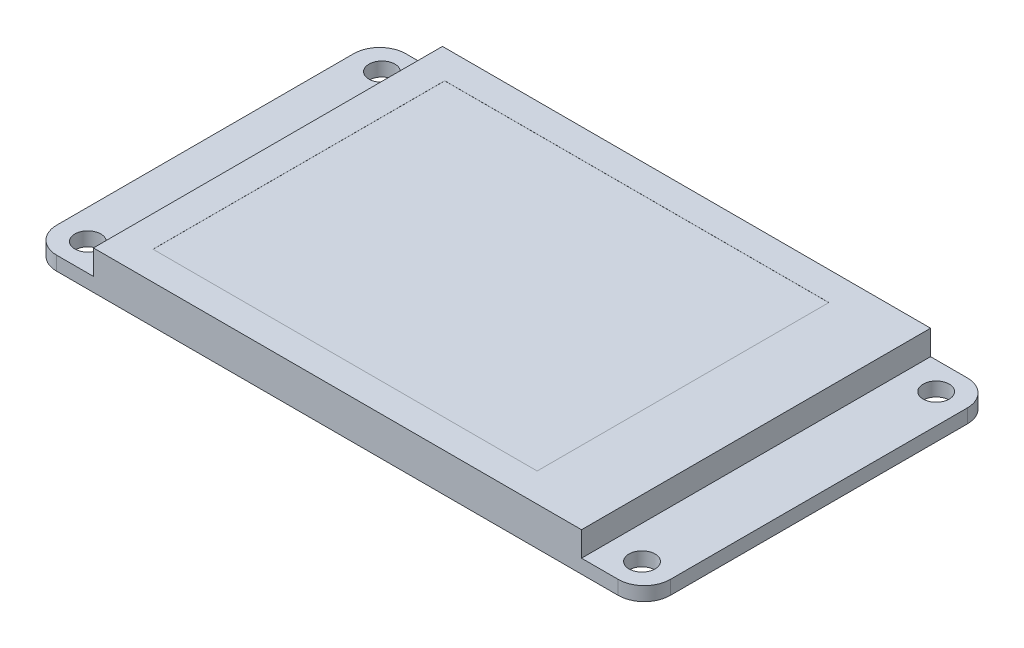
ISO-10303-21;
HEADER;
FILE_DESCRIPTION(('STEP AP214'),'2;1');
FILE_NAME('part.step','',(''),(''),'','','');
FILE_SCHEMA(('AUTOMOTIVE_DESIGN { 1 0 10303 214 1 1 1 1 }'));
ENDSEC;
DATA;
#1=APPLICATION_CONTEXT('core data for automotive mechanical design processes');
#2=APPLICATION_PROTOCOL_DEFINITION('international standard','automotive_design',2000,#1);
#3=PRODUCT_CONTEXT('',#1,'mechanical');
#4=PRODUCT('Part','Part','',(#3));
#5=PRODUCT_RELATED_PRODUCT_CATEGORY('part','',(#4));
#6=PRODUCT_DEFINITION_FORMATION('','',#4);
#7=PRODUCT_DEFINITION_CONTEXT('part definition',#1,'design');
#8=PRODUCT_DEFINITION('design','',#6,#7);
#9=PRODUCT_DEFINITION_SHAPE('','',#8);
#10=(LENGTH_UNIT() NAMED_UNIT(*) SI_UNIT(.MILLI.,.METRE.));
#11=(NAMED_UNIT(*) PLANE_ANGLE_UNIT() SI_UNIT($,.RADIAN.));
#12=(NAMED_UNIT(*) SI_UNIT($,.STERADIAN.) SOLID_ANGLE_UNIT());
#13=UNCERTAINTY_MEASURE_WITH_UNIT(LENGTH_MEASURE(1.E-05),#10,'distance_accuracy_value','');
#14=(GEOMETRIC_REPRESENTATION_CONTEXT(3) GLOBAL_UNCERTAINTY_ASSIGNED_CONTEXT((#13)) GLOBAL_UNIT_ASSIGNED_CONTEXT((#10,
#11,#12)) REPRESENTATION_CONTEXT('',''));
#15=CARTESIAN_POINT('',(0.,0.,0.));
#16=DIRECTION('',(0.,0.,1.));
#17=DIRECTION('',(1.,0.,0.));
#18=AXIS2_PLACEMENT_3D('',#15,#16,#17);
#19=CARTESIAN_POINT('',(0.,1.6,0.));
#20=DIRECTION('',(0.,1.,0.));
#21=DIRECTION('',(0.,0.,1.));
#22=AXIS2_PLACEMENT_3D('',#19,#20,#21);
#23=PLANE('',#22);
#24=DIRECTION('',(0.,0.,1.));
#25=VECTOR('',#24,1.);
#26=CARTESIAN_POINT('',(-30.7569975339088,1.6,-23.259617755857));
#27=LINE('',#26,#25);
#28=CARTESIAN_POINT('',(-30.7569975339088,1.6,-23.259617755857));
#29=VERTEX_POINT('',#28);
#30=CARTESIAN_POINT('',(-30.7569975339088,1.6,16.930382244143));
#31=VERTEX_POINT('',#30);
#32=EDGE_CURVE('E58',#29,#31,#27,.T.);
#33=ORIENTED_EDGE('',*,*,#32,.F.);
#34=DIRECTION('',(-1.,0.,0.));
#35=VECTOR('',#34,1.);
#36=CARTESIAN_POINT('',(-37.9819975339088,1.6,-23.259617755857));
#37=LINE('',#36,#35);
#38=CARTESIAN_POINT('',(-34.9819975339088,1.6,-23.259617755857));
#39=VERTEX_POINT('',#38);
#40=EDGE_CURVE('E246',#29,#39,#37,.T.);
#41=ORIENTED_EDGE('',*,*,#40,.T.);
#42=CARTESIAN_POINT('',(-34.9819975339088,1.6,-20.259617755857));
#43=DIRECTION('',(0.,1.,0.));
#44=DIRECTION('',(0.,0.,1.));
#45=AXIS2_PLACEMENT_3D('',#42,#43,#44);
#46=CIRCLE('',#45,3.);
#47=CARTESIAN_POINT('',(-37.9819975339088,1.6,-20.259617755857));
#48=VERTEX_POINT('',#47);
#49=EDGE_CURVE('E280',#39,#48,#46,.T.);
#50=ORIENTED_EDGE('',*,*,#49,.T.);
#51=DIRECTION('',(0.,0.,1.));
#52=VECTOR('',#51,1.);
#53=CARTESIAN_POINT('',(-37.9819975339088,1.6,-23.259617755857));
#54=LINE('',#53,#52);
#55=CARTESIAN_POINT('',(-37.9819975339088,1.6,13.930382244143));
#56=VERTEX_POINT('',#55);
#57=EDGE_CURVE('E236',#48,#56,#54,.T.);
#58=ORIENTED_EDGE('',*,*,#57,.T.);
#59=CARTESIAN_POINT('',(-34.9819975339088,1.6,13.930382244143));
#60=DIRECTION('',(0.,1.,0.));
#61=DIRECTION('',(0.,0.,1.));
#62=AXIS2_PLACEMENT_3D('',#59,#60,#61);
#63=CIRCLE('',#62,3.);
#64=CARTESIAN_POINT('',(-34.9819975339088,1.6,16.930382244143));
#65=VERTEX_POINT('',#64);
#66=EDGE_CURVE('E278',#56,#65,#63,.T.);
#67=ORIENTED_EDGE('',*,*,#66,.T.);
#68=DIRECTION('',(1.,0.,0.));
#69=VECTOR('',#68,1.);
#70=CARTESIAN_POINT('',(-37.9819975339088,1.6,16.930382244143));
#71=LINE('',#70,#69);
#72=EDGE_CURVE('E241',#65,#31,#71,.T.);
#73=ORIENTED_EDGE('',*,*,#72,.T.);
#74=EDGE_LOOP('',(#33,#41,#50,#58,#67,#73));
#75=FACE_BOUND('',#74,.T.);
#76=CARTESIAN_POINT('',(-34.5619975339088,1.6,-20.099617755857));
#77=DIRECTION('',(0.,1.,0.));
#78=DIRECTION('',(0.,0.,1.));
#79=AXIS2_PLACEMENT_3D('',#76,#77,#78);
#80=CIRCLE('',#79,1.5);
#81=CARTESIAN_POINT('',(-34.5619975339088,1.6,-18.599617755857));
#82=VERTEX_POINT('',#81);
#83=EDGE_CURVE('E221',#82,#82,#80,.T.);
#84=ORIENTED_EDGE('',*,*,#83,.F.);
#85=EDGE_LOOP('',(#84));
#86=FACE_BOUND('',#85,.T.);
#87=CARTESIAN_POINT('',(-34.5619975339088,1.6,13.770382244143));
#88=DIRECTION('',(0.,1.,0.));
#89=DIRECTION('',(0.,0.,1.));
#90=AXIS2_PLACEMENT_3D('',#87,#88,#89);
#91=CIRCLE('',#90,1.5);
#92=CARTESIAN_POINT('',(-34.5619975339088,1.6,15.270382244143));
#93=VERTEX_POINT('',#92);
#94=EDGE_CURVE('E215',#93,#93,#91,.T.);
#95=ORIENTED_EDGE('',*,*,#94,.F.);
#96=EDGE_LOOP('',(#95));
#97=FACE_BOUND('',#96,.T.);
#98=ADVANCED_FACE('F35',(#75,#86,#97),#23,.T.);
#99=CARTESIAN_POINT('',(-37.9819975339088,1.6,-23.259617755857));
#100=DIRECTION('',(1.,0.,0.));
#101=DIRECTION('',(0.,0.,-1.));
#102=AXIS2_PLACEMENT_3D('',#99,#100,#101);
#103=PLANE('',#102);
#104=ORIENTED_EDGE('',*,*,#57,.F.);
#105=DIRECTION('',(0.,-1.,0.));
#106=VECTOR('',#105,1.);
#107=CARTESIAN_POINT('',(-37.9819975339088,1.6,-20.259617755857));
#108=LINE('',#107,#106);
#109=CARTESIAN_POINT('',(-37.9819975339088,0.,-20.259617755857));
#110=VERTEX_POINT('',#109);
#111=EDGE_CURVE('E11',#48,#110,#108,.T.);
#112=ORIENTED_EDGE('',*,*,#111,.T.);
#113=DIRECTION('',(0.,0.,1.));
#114=VECTOR('',#113,1.);
#115=CARTESIAN_POINT('',(-37.9819975339088,0.,-23.259617755857));
#116=LINE('',#115,#114);
#117=CARTESIAN_POINT('',(-37.9819975339088,0.,13.930382244143));
#118=VERTEX_POINT('',#117);
#119=EDGE_CURVE('E233',#110,#118,#116,.T.);
#120=ORIENTED_EDGE('',*,*,#119,.T.);
#121=DIRECTION('',(0.,-1.,0.));
#122=VECTOR('',#121,1.);
#123=CARTESIAN_POINT('',(-37.9819975339088,1.6,13.930382244143));
#124=LINE('',#123,#122);
#125=EDGE_CURVE('E43',#118,#56,#124,.F.);
#126=ORIENTED_EDGE('',*,*,#125,.T.);
#127=EDGE_LOOP('',(#104,#112,#120,#126));
#128=FACE_BOUND('',#127,.T.);
#129=ADVANCED_FACE('F294',(#128),#103,.F.);
#130=CARTESIAN_POINT('',(-37.9819975339088,1.6,16.930382244143));
#131=DIRECTION('',(0.,0.,-1.));
#132=DIRECTION('',(-1.,0.,0.));
#133=AXIS2_PLACEMENT_3D('',#130,#131,#132);
#134=PLANE('',#133);
#135=DIRECTION('',(1.,0.,0.));
#136=VECTOR('',#135,1.);
#137=CARTESIAN_POINT('',(-37.9819975339088,0.,16.930382244143));
#138=LINE('',#137,#136);
#139=CARTESIAN_POINT('',(-34.9819975339088,0.,16.930382244143));
#140=VERTEX_POINT('',#139);
#141=CARTESIAN_POINT('',(29.6680024660912,0.,16.930382244143));
#142=VERTEX_POINT('',#141);
#143=EDGE_CURVE('E252',#140,#142,#138,.T.);
#144=ORIENTED_EDGE('',*,*,#143,.T.);
#145=DIRECTION('',(0.,-1.,0.));
#146=VECTOR('',#145,1.);
#147=CARTESIAN_POINT('',(29.6680024660912,1.6,16.930382244143));
#148=LINE('',#147,#146);
#149=CARTESIAN_POINT('',(29.6680024660912,1.6,16.930382244143));
#150=VERTEX_POINT('',#149);
#151=EDGE_CURVE('E275',#142,#150,#148,.F.);
#152=ORIENTED_EDGE('',*,*,#151,.T.);
#153=CARTESIAN_POINT('',(25.4430024660912,1.6,16.930382244143));
#154=VERTEX_POINT('',#153);
#155=EDGE_CURVE('E239',#154,#150,#71,.T.);
#156=ORIENTED_EDGE('',*,*,#155,.F.);
#157=DIRECTION('',(0.,-1.,0.));
#158=VECTOR('',#157,1.);
#159=CARTESIAN_POINT('',(25.4430024660912,4.44,16.930382244143));
#160=LINE('',#159,#158);
#161=CARTESIAN_POINT('',(25.4430024660912,4.44,16.930382244143));
#162=VERTEX_POINT('',#161);
#163=EDGE_CURVE('E205',#162,#154,#160,.T.);
#164=ORIENTED_EDGE('',*,*,#163,.F.);
#165=DIRECTION('',(1.,0.,0.));
#166=VECTOR('',#165,1.);
#167=CARTESIAN_POINT('',(-30.7569975339088,4.44,16.930382244143));
#168=LINE('',#167,#166);
#169=CARTESIAN_POINT('',(-30.7569975339088,4.44,16.930382244143));
#170=VERTEX_POINT('',#169);
#171=EDGE_CURVE('E189',#170,#162,#168,.T.);
#172=ORIENTED_EDGE('',*,*,#171,.F.);
#173=DIRECTION('',(0.,-1.,0.));
#174=VECTOR('',#173,1.);
#175=CARTESIAN_POINT('',(-30.7569975339088,4.44,16.930382244143));
#176=LINE('',#175,#174);
#177=EDGE_CURVE('E208',#170,#31,#176,.T.);
#178=ORIENTED_EDGE('',*,*,#177,.T.);
#179=ORIENTED_EDGE('',*,*,#72,.F.);
#180=DIRECTION('',(0.,-1.,0.));
#181=VECTOR('',#180,1.);
#182=CARTESIAN_POINT('',(-34.9819975339088,1.6,16.930382244143));
#183=LINE('',#182,#181);
#184=EDGE_CURVE('E272',#65,#140,#183,.T.);
#185=ORIENTED_EDGE('',*,*,#184,.T.);
#186=EDGE_LOOP('',(#144,#152,#156,#164,#172,#178,#179,#185));
#187=FACE_BOUND('',#186,.T.);
#188=ADVANCED_FACE('F305',(#187),#134,.F.);
#189=CARTESIAN_POINT('',(32.6680024660912,1.6,-23.259617755857));
#190=DIRECTION('',(-1.,0.,0.));
#191=DIRECTION('',(0.,0.,1.));
#192=AXIS2_PLACEMENT_3D('',#189,#190,#191);
#193=PLANE('',#192);
#194=DIRECTION('',(0.,0.,-1.));
#195=VECTOR('',#194,1.);
#196=CARTESIAN_POINT('',(32.6680024660912,1.6,-23.259617755857));
#197=LINE('',#196,#195);
#198=CARTESIAN_POINT('',(32.6680024660912,1.6,13.930382244143));
#199=VERTEX_POINT('',#198);
#200=CARTESIAN_POINT('',(32.6680024660912,1.6,-20.259617755857));
#201=VERTEX_POINT('',#200);
#202=EDGE_CURVE('E243',#199,#201,#197,.T.);
#203=ORIENTED_EDGE('',*,*,#202,.F.);
#204=DIRECTION('',(0.,-1.,0.));
#205=VECTOR('',#204,1.);
#206=CARTESIAN_POINT('',(32.6680024660912,1.6,13.930382244143));
#207=LINE('',#206,#205);
#208=CARTESIAN_POINT('',(32.6680024660912,0.,13.930382244143));
#209=VERTEX_POINT('',#208);
#210=EDGE_CURVE('E261',#199,#209,#207,.T.);
#211=ORIENTED_EDGE('',*,*,#210,.T.);
#212=DIRECTION('',(0.,0.,-1.));
#213=VECTOR('',#212,1.);
#214=CARTESIAN_POINT('',(32.6680024660912,0.,-23.259617755857));
#215=LINE('',#214,#213);
#216=CARTESIAN_POINT('',(32.6680024660912,0.,-20.259617755857));
#217=VERTEX_POINT('',#216);
#218=EDGE_CURVE('E255',#209,#217,#215,.T.);
#219=ORIENTED_EDGE('',*,*,#218,.T.);
#220=DIRECTION('',(0.,-1.,0.));
#221=VECTOR('',#220,1.);
#222=CARTESIAN_POINT('',(32.6680024660912,1.6,-20.259617755857));
#223=LINE('',#222,#221);
#224=EDGE_CURVE('E249',#217,#201,#223,.F.);
#225=ORIENTED_EDGE('',*,*,#224,.T.);
#226=EDGE_LOOP('',(#203,#211,#219,#225));
#227=FACE_BOUND('',#226,.T.);
#228=ADVANCED_FACE('F316',(#227),#193,.F.);
#229=CARTESIAN_POINT('',(-37.9819975339088,1.6,-23.259617755857));
#230=DIRECTION('',(0.,0.,1.));
#231=DIRECTION('',(1.,0.,0.));
#232=AXIS2_PLACEMENT_3D('',#229,#230,#231);
#233=PLANE('',#232);
#234=CARTESIAN_POINT('',(29.6680024660912,1.6,-23.259617755857));
#235=VERTEX_POINT('',#234);
#236=CARTESIAN_POINT('',(25.4430024660912,1.6,-23.259617755857));
#237=VERTEX_POINT('',#236);
#238=EDGE_CURVE('E247',#235,#237,#37,.T.);
#239=ORIENTED_EDGE('',*,*,#238,.F.);
#240=DIRECTION('',(0.,-1.,0.));
#241=VECTOR('',#240,1.);
#242=CARTESIAN_POINT('',(29.6680024660912,1.6,-23.259617755857));
#243=LINE('',#242,#241);
#244=CARTESIAN_POINT('',(29.6680024660912,0.,-23.259617755857));
#245=VERTEX_POINT('',#244);
#246=EDGE_CURVE('E289',#235,#245,#243,.T.);
#247=ORIENTED_EDGE('',*,*,#246,.T.);
#248=DIRECTION('',(-1.,0.,0.));
#249=VECTOR('',#248,1.);
#250=CARTESIAN_POINT('',(-37.9819975339088,0.,-23.259617755857));
#251=LINE('',#250,#249);
#252=CARTESIAN_POINT('',(-34.9819975339088,0.,-23.259617755857));
#253=VERTEX_POINT('',#252);
#254=EDGE_CURVE('E240',#245,#253,#251,.T.);
#255=ORIENTED_EDGE('',*,*,#254,.T.);
#256=DIRECTION('',(0.,-1.,0.));
#257=VECTOR('',#256,1.);
#258=CARTESIAN_POINT('',(-34.9819975339088,1.6,-23.259617755857));
#259=LINE('',#258,#257);
#260=EDGE_CURVE('E286',#253,#39,#259,.F.);
#261=ORIENTED_EDGE('',*,*,#260,.T.);
#262=ORIENTED_EDGE('',*,*,#40,.F.);
#263=DIRECTION('',(0.,-1.,0.));
#264=VECTOR('',#263,1.);
#265=CARTESIAN_POINT('',(-30.7569975339088,4.44,-23.259617755857));
#266=LINE('',#265,#264);
#267=CARTESIAN_POINT('',(-30.7569975339088,4.44,-23.259617755857));
#268=VERTEX_POINT('',#267);
#269=EDGE_CURVE('E196',#268,#29,#266,.T.);
#270=ORIENTED_EDGE('',*,*,#269,.F.);
#271=DIRECTION('',(-1.,0.,0.));
#272=VECTOR('',#271,1.);
#273=CARTESIAN_POINT('',(-30.7569975339088,4.44,-23.259617755857));
#274=LINE('',#273,#272);
#275=CARTESIAN_POINT('',(25.4430024660912,4.44,-23.259617755857));
#276=VERTEX_POINT('',#275);
#277=EDGE_CURVE('E194',#276,#268,#274,.T.);
#278=ORIENTED_EDGE('',*,*,#277,.F.);
#279=DIRECTION('',(0.,-1.,0.));
#280=VECTOR('',#279,1.);
#281=CARTESIAN_POINT('',(25.4430024660912,4.44,-23.259617755857));
#282=LINE('',#281,#280);
#283=EDGE_CURVE('E202',#276,#237,#282,.T.);
#284=ORIENTED_EDGE('',*,*,#283,.T.);
#285=EDGE_LOOP('',(#239,#247,#255,#261,#262,#270,#278,#284));
#286=FACE_BOUND('',#285,.T.);
#287=ADVANCED_FACE('F328',(#286),#233,.F.);
#288=DIRECTION('',(0.,0.,-1.));
#289=VECTOR('',#288,1.);
#290=CARTESIAN_POINT('',(25.4430024660912,1.6,-23.259617755857));
#291=LINE('',#290,#289);
#292=EDGE_CURVE('E190',#154,#237,#291,.T.);
#293=ORIENTED_EDGE('',*,*,#292,.F.);
#294=ORIENTED_EDGE('',*,*,#155,.T.);
#295=CARTESIAN_POINT('',(29.6680024660912,1.6,13.930382244143));
#296=DIRECTION('',(0.,1.,0.));
#297=DIRECTION('',(0.,0.,1.));
#298=AXIS2_PLACEMENT_3D('',#295,#296,#297);
#299=CIRCLE('',#298,3.);
#300=EDGE_CURVE('E284',#150,#199,#299,.T.);
#301=ORIENTED_EDGE('',*,*,#300,.T.);
#302=ORIENTED_EDGE('',*,*,#202,.T.);
#303=CARTESIAN_POINT('',(29.6680024660912,1.6,-20.259617755857));
#304=DIRECTION('',(0.,1.,0.));
#305=DIRECTION('',(0.,0.,1.));
#306=AXIS2_PLACEMENT_3D('',#303,#304,#305);
#307=CIRCLE('',#306,3.);
#308=EDGE_CURVE('E282',#201,#235,#307,.T.);
#309=ORIENTED_EDGE('',*,*,#308,.T.);
#310=ORIENTED_EDGE('',*,*,#238,.T.);
#311=EDGE_LOOP('',(#293,#294,#301,#302,#309,#310));
#312=FACE_BOUND('',#311,.T.);
#313=CARTESIAN_POINT('',(29.2480024660912,1.6,-20.099617755857));
#314=DIRECTION('',(0.,1.,0.));
#315=DIRECTION('',(0.,0.,1.));
#316=AXIS2_PLACEMENT_3D('',#313,#314,#315);
#317=CIRCLE('',#316,1.5);
#318=CARTESIAN_POINT('',(29.2480024660912,1.6,-18.599617755857));
#319=VERTEX_POINT('',#318);
#320=EDGE_CURVE('E222',#319,#319,#317,.T.);
#321=ORIENTED_EDGE('',*,*,#320,.F.);
#322=EDGE_LOOP('',(#321));
#323=FACE_BOUND('',#322,.T.);
#324=CARTESIAN_POINT('',(29.2480024660912,1.6,13.770382244143));
#325=DIRECTION('',(0.,1.,0.));
#326=DIRECTION('',(0.,0.,1.));
#327=AXIS2_PLACEMENT_3D('',#324,#325,#326);
#328=CIRCLE('',#327,1.5);
#329=CARTESIAN_POINT('',(29.2480024660912,1.6,15.270382244143));
#330=VERTEX_POINT('',#329);
#331=EDGE_CURVE('E211',#330,#330,#328,.T.);
#332=ORIENTED_EDGE('',*,*,#331,.F.);
#333=EDGE_LOOP('',(#332));
#334=FACE_BOUND('',#333,.T.);
#335=ADVANCED_FACE('F320',(#312,#323,#334),#23,.T.);
#336=CARTESIAN_POINT('',(0.,0.,0.));
#337=DIRECTION('',(0.,1.,0.));
#338=DIRECTION('',(0.,0.,1.));
#339=AXIS2_PLACEMENT_3D('',#336,#337,#338);
#340=PLANE('',#339);
#341=CARTESIAN_POINT('',(29.2480024660912,0.,-20.099617755857));
#342=DIRECTION('',(0.,1.,0.));
#343=DIRECTION('',(0.,0.,1.));
#344=AXIS2_PLACEMENT_3D('',#341,#342,#343);
#345=CIRCLE('',#344,1.5);
#346=CARTESIAN_POINT('',(29.2480024660912,0.,-18.599617755857));
#347=VERTEX_POINT('',#346);
#348=EDGE_CURVE('E218',#347,#347,#345,.T.);
#349=ORIENTED_EDGE('',*,*,#348,.T.);
#350=EDGE_LOOP('',(#349));
#351=FACE_BOUND('',#350,.T.);
#352=CARTESIAN_POINT('',(-34.5619975339088,0.,13.770382244143));
#353=DIRECTION('',(0.,1.,0.));
#354=DIRECTION('',(0.,0.,1.));
#355=AXIS2_PLACEMENT_3D('',#352,#353,#354);
#356=CIRCLE('',#355,1.5);
#357=CARTESIAN_POINT('',(-34.5619975339088,0.,15.270382244143));
#358=VERTEX_POINT('',#357);
#359=EDGE_CURVE('E225',#358,#358,#356,.T.);
#360=ORIENTED_EDGE('',*,*,#359,.T.);
#361=EDGE_LOOP('',(#360));
#362=FACE_BOUND('',#361,.T.);
#363=CARTESIAN_POINT('',(29.2480024660912,0.,13.770382244143));
#364=DIRECTION('',(0.,1.,0.));
#365=DIRECTION('',(0.,0.,1.));
#366=AXIS2_PLACEMENT_3D('',#363,#364,#365);
#367=CIRCLE('',#366,1.5);
#368=CARTESIAN_POINT('',(29.2480024660912,0.,15.270382244143));
#369=VERTEX_POINT('',#368);
#370=EDGE_CURVE('E212',#369,#369,#367,.T.);
#371=ORIENTED_EDGE('',*,*,#370,.T.);
#372=EDGE_LOOP('',(#371));
#373=FACE_BOUND('',#372,.T.);
#374=CARTESIAN_POINT('',(-34.5619975339088,0.,-20.099617755857));
#375=DIRECTION('',(0.,1.,0.));
#376=DIRECTION('',(0.,0.,1.));
#377=AXIS2_PLACEMENT_3D('',#374,#375,#376);
#378=CIRCLE('',#377,1.5);
#379=CARTESIAN_POINT('',(-34.5619975339088,0.,-18.599617755857));
#380=VERTEX_POINT('',#379);
#381=EDGE_CURVE('E230',#380,#380,#378,.T.);
#382=ORIENTED_EDGE('',*,*,#381,.T.);
#383=EDGE_LOOP('',(#382));
#384=FACE_BOUND('',#383,.T.);
#385=ORIENTED_EDGE('',*,*,#218,.F.);
#386=CARTESIAN_POINT('',(29.6680024660912,0.,13.930382244143));
#387=DIRECTION('',(0.,1.,0.));
#388=DIRECTION('',(0.,0.,1.));
#389=AXIS2_PLACEMENT_3D('',#386,#387,#388);
#390=CIRCLE('',#389,3.);
#391=EDGE_CURVE('E270',#209,#142,#390,.F.);
#392=ORIENTED_EDGE('',*,*,#391,.T.);
#393=ORIENTED_EDGE('',*,*,#143,.F.);
#394=CARTESIAN_POINT('',(-34.9819975339088,0.,13.930382244143));
#395=DIRECTION('',(0.,1.,0.));
#396=DIRECTION('',(0.,0.,1.));
#397=AXIS2_PLACEMENT_3D('',#394,#395,#396);
#398=CIRCLE('',#397,3.);
#399=EDGE_CURVE('E264',#140,#118,#398,.F.);
#400=ORIENTED_EDGE('',*,*,#399,.T.);
#401=ORIENTED_EDGE('',*,*,#119,.F.);
#402=CARTESIAN_POINT('',(-34.9819975339088,0.,-20.259617755857));
#403=DIRECTION('',(0.,1.,0.));
#404=DIRECTION('',(0.,0.,1.));
#405=AXIS2_PLACEMENT_3D('',#402,#403,#404);
#406=CIRCLE('',#405,3.);
#407=EDGE_CURVE('E266',#110,#253,#406,.F.);
#408=ORIENTED_EDGE('',*,*,#407,.T.);
#409=ORIENTED_EDGE('',*,*,#254,.F.);
#410=CARTESIAN_POINT('',(29.6680024660912,0.,-20.259617755857));
#411=DIRECTION('',(0.,1.,0.));
#412=DIRECTION('',(0.,0.,1.));
#413=AXIS2_PLACEMENT_3D('',#410,#411,#412);
#414=CIRCLE('',#413,3.);
#415=EDGE_CURVE('E268',#245,#217,#414,.F.);
#416=ORIENTED_EDGE('',*,*,#415,.T.);
#417=EDGE_LOOP('',(#385,#392,#393,#400,#401,#408,#409,#416));
#418=FACE_BOUND('',#417,.T.);
#419=ADVANCED_FACE('F309',(#351,#362,#373,#384,#418),#340,.F.);
#420=CARTESIAN_POINT('',(29.6680024660912,1.6,13.930382244143));
#421=DIRECTION('',(0.,-1.,0.));
#422=DIRECTION('',(0.,0.,-1.));
#423=AXIS2_PLACEMENT_3D('',#420,#421,#422);
#424=CYLINDRICAL_SURFACE('',#423,3.);
#425=ORIENTED_EDGE('',*,*,#300,.F.);
#426=ORIENTED_EDGE('',*,*,#151,.F.);
#427=ORIENTED_EDGE('',*,*,#391,.F.);
#428=ORIENTED_EDGE('',*,*,#210,.F.);
#429=EDGE_LOOP('',(#425,#426,#427,#428));
#430=FACE_BOUND('',#429,.T.);
#431=ADVANCED_FACE('F313',(#430),#424,.T.);
#432=CARTESIAN_POINT('',(29.6680024660912,1.6,-20.259617755857));
#433=DIRECTION('',(0.,-1.,0.));
#434=DIRECTION('',(0.,0.,-1.));
#435=AXIS2_PLACEMENT_3D('',#432,#433,#434);
#436=CYLINDRICAL_SURFACE('',#435,3.);
#437=ORIENTED_EDGE('',*,*,#308,.F.);
#438=ORIENTED_EDGE('',*,*,#224,.F.);
#439=ORIENTED_EDGE('',*,*,#415,.F.);
#440=ORIENTED_EDGE('',*,*,#246,.F.);
#441=EDGE_LOOP('',(#437,#438,#439,#440));
#442=FACE_BOUND('',#441,.T.);
#443=ADVANCED_FACE('F325',(#442),#436,.T.);
#444=CARTESIAN_POINT('',(-34.9819975339088,1.6,-20.259617755857));
#445=DIRECTION('',(0.,-1.,0.));
#446=DIRECTION('',(0.,0.,-1.));
#447=AXIS2_PLACEMENT_3D('',#444,#445,#446);
#448=CYLINDRICAL_SURFACE('',#447,3.);
#449=ORIENTED_EDGE('',*,*,#49,.F.);
#450=ORIENTED_EDGE('',*,*,#260,.F.);
#451=ORIENTED_EDGE('',*,*,#407,.F.);
#452=ORIENTED_EDGE('',*,*,#111,.F.);
#453=EDGE_LOOP('',(#449,#450,#451,#452));
#454=FACE_BOUND('',#453,.T.);
#455=ADVANCED_FACE('F331',(#454),#448,.T.);
#456=CARTESIAN_POINT('',(-34.9819975339088,1.6,13.930382244143));
#457=DIRECTION('',(0.,-1.,0.));
#458=DIRECTION('',(0.,0.,-1.));
#459=AXIS2_PLACEMENT_3D('',#456,#457,#458);
#460=CYLINDRICAL_SURFACE('',#459,3.);
#461=ORIENTED_EDGE('',*,*,#66,.F.);
#462=ORIENTED_EDGE('',*,*,#125,.F.);
#463=ORIENTED_EDGE('',*,*,#399,.F.);
#464=ORIENTED_EDGE('',*,*,#184,.F.);
#465=EDGE_LOOP('',(#461,#462,#463,#464));
#466=FACE_BOUND('',#465,.T.);
#467=ADVANCED_FACE('F37',(#466),#460,.T.);
#468=CARTESIAN_POINT('',(-34.5619975339088,0.,-20.099617755857));
#469=DIRECTION('',(0.,1.,0.));
#470=DIRECTION('',(0.,0.,1.));
#471=AXIS2_PLACEMENT_3D('',#468,#469,#470);
#472=CYLINDRICAL_SURFACE('',#471,1.5);
#473=ORIENTED_EDGE('',*,*,#381,.F.);
#474=EDGE_LOOP('',(#473));
#475=FACE_BOUND('',#474,.T.);
#476=ORIENTED_EDGE('',*,*,#83,.T.);
#477=EDGE_LOOP('',(#476));
#478=FACE_BOUND('',#477,.T.);
#479=ADVANCED_FACE('F385',(#475,#478),#472,.F.);
#480=CARTESIAN_POINT('',(29.2480024660912,0.,13.770382244143));
#481=DIRECTION('',(0.,1.,0.));
#482=DIRECTION('',(0.,0.,1.));
#483=AXIS2_PLACEMENT_3D('',#480,#481,#482);
#484=CYLINDRICAL_SURFACE('',#483,1.5);
#485=ORIENTED_EDGE('',*,*,#370,.F.);
#486=EDGE_LOOP('',(#485));
#487=FACE_BOUND('',#486,.T.);
#488=ORIENTED_EDGE('',*,*,#331,.T.);
#489=EDGE_LOOP('',(#488));
#490=FACE_BOUND('',#489,.T.);
#491=ADVANCED_FACE('F389',(#487,#490),#484,.F.);
#492=CARTESIAN_POINT('',(-34.5619975339088,0.,13.770382244143));
#493=DIRECTION('',(0.,1.,0.));
#494=DIRECTION('',(0.,0.,1.));
#495=AXIS2_PLACEMENT_3D('',#492,#493,#494);
#496=CYLINDRICAL_SURFACE('',#495,1.5);
#497=ORIENTED_EDGE('',*,*,#359,.F.);
#498=EDGE_LOOP('',(#497));
#499=FACE_BOUND('',#498,.T.);
#500=ORIENTED_EDGE('',*,*,#94,.T.);
#501=EDGE_LOOP('',(#500));
#502=FACE_BOUND('',#501,.T.);
#503=ADVANCED_FACE('F394',(#499,#502),#496,.F.);
#504=CARTESIAN_POINT('',(29.2480024660912,0.,-20.099617755857));
#505=DIRECTION('',(0.,1.,0.));
#506=DIRECTION('',(0.,0.,1.));
#507=AXIS2_PLACEMENT_3D('',#504,#505,#506);
#508=CYLINDRICAL_SURFACE('',#507,1.5);
#509=ORIENTED_EDGE('',*,*,#348,.F.);
#510=EDGE_LOOP('',(#509));
#511=FACE_BOUND('',#510,.T.);
#512=ORIENTED_EDGE('',*,*,#320,.T.);
#513=EDGE_LOOP('',(#512));
#514=FACE_BOUND('',#513,.T.);
#515=ADVANCED_FACE('F354',(#511,#514),#508,.F.);
#516=CARTESIAN_POINT('',(-30.7569975339088,4.44,-23.259617755857));
#517=DIRECTION('',(1.,0.,0.));
#518=DIRECTION('',(0.,0.,-1.));
#519=AXIS2_PLACEMENT_3D('',#516,#517,#518);
#520=PLANE('',#519);
#521=ORIENTED_EDGE('',*,*,#32,.T.);
#522=ORIENTED_EDGE('',*,*,#177,.F.);
#523=DIRECTION('',(0.,0.,1.));
#524=VECTOR('',#523,1.);
#525=CARTESIAN_POINT('',(-30.7569975339088,4.44,-23.259617755857));
#526=LINE('',#525,#524);
#527=EDGE_CURVE('E186',#268,#170,#526,.T.);
#528=ORIENTED_EDGE('',*,*,#527,.F.);
#529=ORIENTED_EDGE('',*,*,#269,.T.);
#530=EDGE_LOOP('',(#521,#522,#528,#529));
#531=FACE_BOUND('',#530,.T.);
#532=ADVANCED_FACE('F336',(#531),#520,.F.);
#533=CARTESIAN_POINT('',(25.4430024660912,4.44,-23.259617755857));
#534=DIRECTION('',(-1.,0.,0.));
#535=DIRECTION('',(0.,0.,1.));
#536=AXIS2_PLACEMENT_3D('',#533,#534,#535);
#537=PLANE('',#536);
#538=ORIENTED_EDGE('',*,*,#292,.T.);
#539=ORIENTED_EDGE('',*,*,#283,.F.);
#540=DIRECTION('',(0.,0.,-1.));
#541=VECTOR('',#540,1.);
#542=CARTESIAN_POINT('',(25.4430024660912,4.44,-23.259617755857));
#543=LINE('',#542,#541);
#544=EDGE_CURVE('E192',#162,#276,#543,.T.);
#545=ORIENTED_EDGE('',*,*,#544,.F.);
#546=ORIENTED_EDGE('',*,*,#163,.T.);
#547=EDGE_LOOP('',(#538,#539,#545,#546));
#548=FACE_BOUND('',#547,.T.);
#549=ADVANCED_FACE('F344',(#548),#537,.F.);
#550=CARTESIAN_POINT('',(0.,4.44,0.));
#551=DIRECTION('',(0.,1.,0.));
#552=DIRECTION('',(0.,0.,1.));
#553=AXIS2_PLACEMENT_3D('',#550,#551,#552);
#554=PLANE('',#553);
#555=DIRECTION('',(0.,0.,1.));
#556=VECTOR('',#555,1.);
#557=CARTESIAN_POINT('',(-27.1969975339088,4.44,-19.959617755857));
#558=LINE('',#557,#556);
#559=CARTESIAN_POINT('',(-27.1969975339088,4.44,-19.959617755857));
#560=VERTEX_POINT('',#559);
#561=CARTESIAN_POINT('',(-27.1969975339088,4.44,13.630382244143));
#562=VERTEX_POINT('',#561);
#563=EDGE_CURVE('E50',#560,#562,#558,.T.);
#564=ORIENTED_EDGE('',*,*,#563,.F.);
#565=DIRECTION('',(-1.,0.,0.));
#566=VECTOR('',#565,1.);
#567=CARTESIAN_POINT('',(-27.1969975339088,4.44,-19.959617755857));
#568=LINE('',#567,#566);
#569=CARTESIAN_POINT('',(17.0330024660912,4.44,-19.959617755857));
#570=VERTEX_POINT('',#569);
#571=EDGE_CURVE('E168',#570,#560,#568,.T.);
#572=ORIENTED_EDGE('',*,*,#571,.F.);
#573=DIRECTION('',(0.,0.,-1.));
#574=VECTOR('',#573,1.);
#575=CARTESIAN_POINT('',(17.0330024660912,4.44,-19.959617755857));
#576=LINE('',#575,#574);
#577=CARTESIAN_POINT('',(17.0330024660912,4.44,13.630382244143));
#578=VERTEX_POINT('',#577);
#579=EDGE_CURVE('E171',#578,#570,#576,.T.);
#580=ORIENTED_EDGE('',*,*,#579,.F.);
#581=DIRECTION('',(1.,0.,0.));
#582=VECTOR('',#581,1.);
#583=CARTESIAN_POINT('',(-27.1969975339088,4.44,13.630382244143));
#584=LINE('',#583,#582);
#585=EDGE_CURVE('E177',#562,#578,#584,.T.);
#586=ORIENTED_EDGE('',*,*,#585,.F.);
#587=EDGE_LOOP('',(#564,#572,#580,#586));
#588=FACE_BOUND('',#587,.T.);
#589=ORIENTED_EDGE('',*,*,#527,.T.);
#590=ORIENTED_EDGE('',*,*,#171,.T.);
#591=ORIENTED_EDGE('',*,*,#544,.T.);
#592=ORIENTED_EDGE('',*,*,#277,.T.);
#593=EDGE_LOOP('',(#589,#590,#591,#592));
#594=FACE_BOUND('',#593,.T.);
#595=ADVANCED_FACE('F339',(#588,#594),#554,.T.);
#596=CARTESIAN_POINT('',(-27.1969975339088,4.43,-19.959617755857));
#597=DIRECTION('',(-1.,0.,0.));
#598=DIRECTION('',(0.,0.,1.));
#599=AXIS2_PLACEMENT_3D('',#596,#597,#598);
#600=PLANE('',#599);
#601=ORIENTED_EDGE('',*,*,#563,.T.);
#602=DIRECTION('',(0.,1.,0.));
#603=VECTOR('',#602,1.);
#604=CARTESIAN_POINT('',(-27.1969975339088,4.43,13.630382244143));
#605=LINE('',#604,#603);
#606=CARTESIAN_POINT('',(-27.1969975339088,4.43,13.630382244143));
#607=VERTEX_POINT('',#606);
#608=EDGE_CURVE('E146',#607,#562,#605,.T.);
#609=ORIENTED_EDGE('',*,*,#608,.F.);
#610=DIRECTION('',(0.,0.,1.));
#611=VECTOR('',#610,1.);
#612=CARTESIAN_POINT('',(-27.1969975339088,4.43,-19.959617755857));
#613=LINE('',#612,#611);
#614=CARTESIAN_POINT('',(-27.1969975339088,4.43,-19.959617755857));
#615=VERTEX_POINT('',#614);
#616=EDGE_CURVE('E150',#615,#607,#613,.T.);
#617=ORIENTED_EDGE('',*,*,#616,.F.);
#618=DIRECTION('',(0.,1.,0.));
#619=VECTOR('',#618,1.);
#620=CARTESIAN_POINT('',(-27.1969975339088,4.43,-19.959617755857));
#621=LINE('',#620,#619);
#622=EDGE_CURVE('E181',#615,#560,#621,.T.);
#623=ORIENTED_EDGE('',*,*,#622,.T.);
#624=EDGE_LOOP('',(#601,#609,#617,#623));
#625=FACE_BOUND('',#624,.T.);
#626=ADVANCED_FACE('F148',(#625),#600,.F.);
#627=CARTESIAN_POINT('',(-27.1969975339088,4.43,-19.959617755857));
#628=DIRECTION('',(0.,0.,-1.));
#629=DIRECTION('',(-1.,0.,0.));
#630=AXIS2_PLACEMENT_3D('',#627,#628,#629);
#631=PLANE('',#630);
#632=ORIENTED_EDGE('',*,*,#571,.T.);
#633=ORIENTED_EDGE('',*,*,#622,.F.);
#634=DIRECTION('',(-1.,0.,0.));
#635=VECTOR('',#634,1.);
#636=CARTESIAN_POINT('',(-27.1969975339088,4.43,-19.959617755857));
#637=LINE('',#636,#635);
#638=CARTESIAN_POINT('',(17.0330024660912,4.43,-19.959617755857));
#639=VERTEX_POINT('',#638);
#640=EDGE_CURVE('E156',#639,#615,#637,.T.);
#641=ORIENTED_EDGE('',*,*,#640,.F.);
#642=DIRECTION('',(0.,1.,0.));
#643=VECTOR('',#642,1.);
#644=CARTESIAN_POINT('',(17.0330024660912,4.43,-19.959617755857));
#645=LINE('',#644,#643);
#646=EDGE_CURVE('E183',#639,#570,#645,.T.);
#647=ORIENTED_EDGE('',*,*,#646,.T.);
#648=EDGE_LOOP('',(#632,#633,#641,#647));
#649=FACE_BOUND('',#648,.T.);
#650=ADVANCED_FACE('F452',(#649),#631,.F.);
#651=CARTESIAN_POINT('',(17.0330024660912,4.43,-19.959617755857));
#652=DIRECTION('',(1.,0.,0.));
#653=DIRECTION('',(0.,0.,-1.));
#654=AXIS2_PLACEMENT_3D('',#651,#652,#653);
#655=PLANE('',#654);
#656=ORIENTED_EDGE('',*,*,#579,.T.);
#657=ORIENTED_EDGE('',*,*,#646,.F.);
#658=DIRECTION('',(0.,0.,-1.));
#659=VECTOR('',#658,1.);
#660=CARTESIAN_POINT('',(17.0330024660912,4.43,-19.959617755857));
#661=LINE('',#660,#659);
#662=CARTESIAN_POINT('',(17.0330024660912,4.43,13.630382244143));
#663=VERTEX_POINT('',#662);
#664=EDGE_CURVE('E164',#663,#639,#661,.T.);
#665=ORIENTED_EDGE('',*,*,#664,.F.);
#666=DIRECTION('',(0.,1.,0.));
#667=VECTOR('',#666,1.);
#668=CARTESIAN_POINT('',(17.0330024660912,4.43,13.630382244143));
#669=LINE('',#668,#667);
#670=EDGE_CURVE('E155',#663,#578,#669,.T.);
#671=ORIENTED_EDGE('',*,*,#670,.T.);
#672=EDGE_LOOP('',(#656,#657,#665,#671));
#673=FACE_BOUND('',#672,.T.);
#674=ADVANCED_FACE('F461',(#673),#655,.F.);
#675=CARTESIAN_POINT('',(-27.1969975339088,4.43,13.630382244143));
#676=DIRECTION('',(0.,0.,1.));
#677=DIRECTION('',(1.,0.,0.));
#678=AXIS2_PLACEMENT_3D('',#675,#676,#677);
#679=PLANE('',#678);
#680=ORIENTED_EDGE('',*,*,#585,.T.);
#681=ORIENTED_EDGE('',*,*,#670,.F.);
#682=DIRECTION('',(1.,0.,0.));
#683=VECTOR('',#682,1.);
#684=CARTESIAN_POINT('',(-27.1969975339088,4.43,13.630382244143));
#685=LINE('',#684,#683);
#686=EDGE_CURVE('E159',#607,#663,#685,.T.);
#687=ORIENTED_EDGE('',*,*,#686,.F.);
#688=ORIENTED_EDGE('',*,*,#608,.T.);
#689=EDGE_LOOP('',(#680,#681,#687,#688));
#690=FACE_BOUND('',#689,.T.);
#691=ADVANCED_FACE('F160',(#690),#679,.F.);
#692=CARTESIAN_POINT('',(0.,4.43,0.));
#693=DIRECTION('',(0.,1.,0.));
#694=DIRECTION('',(0.,0.,1.));
#695=AXIS2_PLACEMENT_3D('',#692,#693,#694);
#696=PLANE('',#695);
#697=ORIENTED_EDGE('',*,*,#616,.T.);
#698=ORIENTED_EDGE('',*,*,#686,.T.);
#699=ORIENTED_EDGE('',*,*,#664,.T.);
#700=ORIENTED_EDGE('',*,*,#640,.T.);
#701=EDGE_LOOP('',(#697,#698,#699,#700));
#702=FACE_BOUND('',#701,.T.);
#703=ADVANCED_FACE('F166',(#702),#696,.T.);
#704=CLOSED_SHELL('',(#98,#129,#188,#228,#287,#335,#419,#431,#443,#455,#467,#479,#491,#503,#515,
#532,#549,#595,#626,#650,#674,#691,#703));
#705=MANIFOLD_SOLID_BREP('B2',#704);
#706=ADVANCED_BREP_SHAPE_REPRESENTATION('',(#18,#705),#14);
#707=SHAPE_DEFINITION_REPRESENTATION(#9,#706);
ENDSEC;
END-ISO-10303-21;
